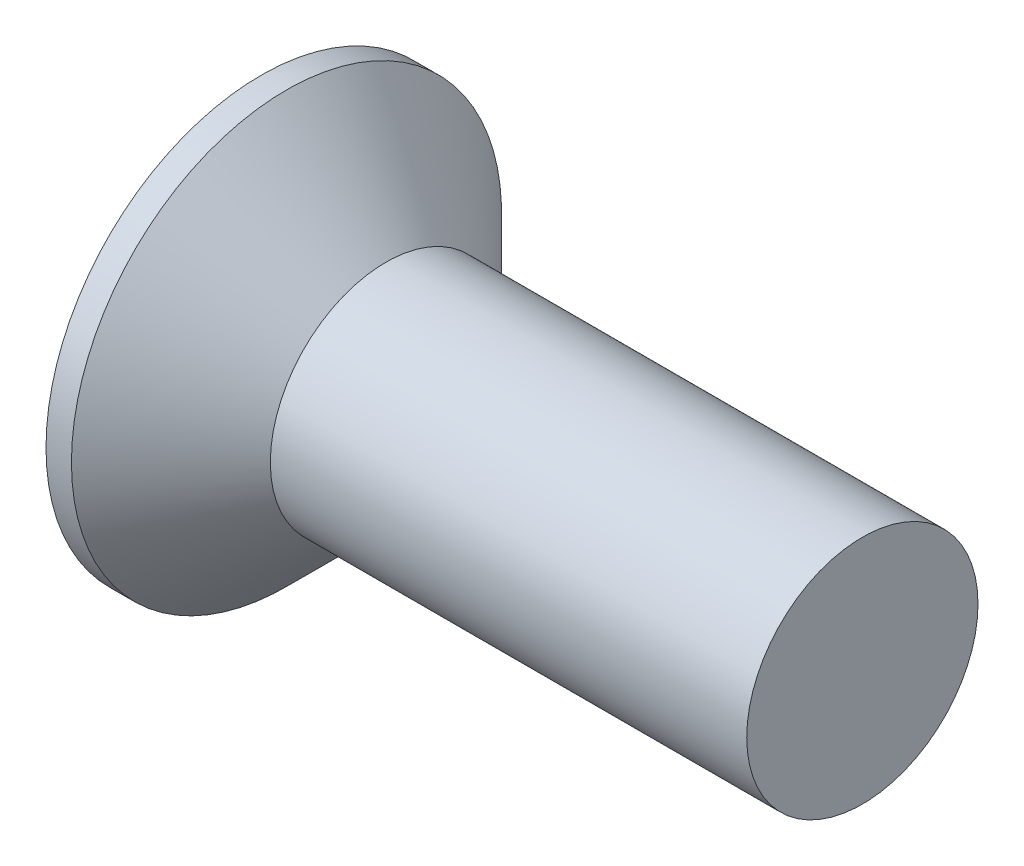
ISO-10303-21;
HEADER;
FILE_DESCRIPTION(('STEP AP214'),'2;1');
FILE_NAME('part.step','',(''),(''),'','','');
FILE_SCHEMA(('AUTOMOTIVE_DESIGN { 1 0 10303 214 1 1 1 1 }'));
ENDSEC;
DATA;
#1=APPLICATION_CONTEXT('core data for automotive mechanical design processes');
#2=APPLICATION_PROTOCOL_DEFINITION('international standard','automotive_design',2000,#1);
#3=PRODUCT_CONTEXT('',#1,'mechanical');
#4=PRODUCT('Part','Part','',(#3));
#5=PRODUCT_RELATED_PRODUCT_CATEGORY('part','',(#4));
#6=PRODUCT_DEFINITION_FORMATION('','',#4);
#7=PRODUCT_DEFINITION_CONTEXT('part definition',#1,'design');
#8=PRODUCT_DEFINITION('design','',#6,#7);
#9=PRODUCT_DEFINITION_SHAPE('','',#8);
#10=(LENGTH_UNIT() NAMED_UNIT(*) SI_UNIT(.MILLI.,.METRE.));
#11=(NAMED_UNIT(*) PLANE_ANGLE_UNIT() SI_UNIT($,.RADIAN.));
#12=(NAMED_UNIT(*) SI_UNIT($,.STERADIAN.) SOLID_ANGLE_UNIT());
#13=UNCERTAINTY_MEASURE_WITH_UNIT(LENGTH_MEASURE(1.E-05),#10,'distance_accuracy_value','');
#14=(GEOMETRIC_REPRESENTATION_CONTEXT(3) GLOBAL_UNCERTAINTY_ASSIGNED_CONTEXT((#13)) GLOBAL_UNIT_ASSIGNED_CONTEXT((#10,
#11,#12)) REPRESENTATION_CONTEXT('',''));
#15=CARTESIAN_POINT('',(0.,0.,0.));
#16=DIRECTION('',(0.,0.,1.));
#17=DIRECTION('',(1.,0.,0.));
#18=AXIS2_PLACEMENT_3D('',#15,#16,#17);
#19=CARTESIAN_POINT('',(3.35,0.26,-0.26));
#20=DIRECTION('',(1.,0.,0.));
#21=DIRECTION('',(0.,0.,-1.));
#22=AXIS2_PLACEMENT_3D('',#19,#20,#21);
#23=PLANE('',#22);
#24=DIRECTION('',(0.,0.,1.));
#25=VECTOR('',#24,1.);
#26=CARTESIAN_POINT('',(3.35,-0.260000000000001,-0.52));
#27=LINE('',#26,#25);
#28=CARTESIAN_POINT('',(3.35,-0.260000000000001,0.259999999999999));
#29=VERTEX_POINT('',#28);
#30=CARTESIAN_POINT('',(3.35,-0.260000000000001,-0.260000000000001));
#31=VERTEX_POINT('',#30);
#32=EDGE_CURVE('E83',#29,#31,#27,.F.);
#33=ORIENTED_EDGE('',*,*,#32,.F.);
#34=DIRECTION('',(0.,1.,0.));
#35=VECTOR('',#34,1.);
#36=CARTESIAN_POINT('',(3.35,-0.520000000000009,0.259999999999998));
#37=LINE('',#36,#35);
#38=CARTESIAN_POINT('',(3.35,0.26,0.26));
#39=VERTEX_POINT('',#38);
#40=EDGE_CURVE('E122',#39,#29,#37,.F.);
#41=ORIENTED_EDGE('',*,*,#40,.F.);
#42=DIRECTION('',(0.,0.,1.));
#43=VECTOR('',#42,1.);
#44=CARTESIAN_POINT('',(3.35,0.259999999999999,0.52));
#45=LINE('',#44,#43);
#46=CARTESIAN_POINT('',(3.35,0.26,-0.260000000000001));
#47=VERTEX_POINT('',#46);
#48=EDGE_CURVE('E79',#47,#39,#45,.T.);
#49=ORIENTED_EDGE('',*,*,#48,.F.);
#50=DIRECTION('',(0.,1.,0.));
#51=VECTOR('',#50,1.);
#52=CARTESIAN_POINT('',(3.35,0.520000000000009,-0.26));
#53=LINE('',#52,#51);
#54=EDGE_CURVE('E81',#31,#47,#53,.T.);
#55=ORIENTED_EDGE('',*,*,#54,.F.);
#56=EDGE_LOOP('',(#33,#41,#49,#55));
#57=FACE_BOUND('',#56,.T.);
#58=ADVANCED_FACE('F17',(#57),#23,.F.);
#59=CARTESIAN_POINT('',(0.,0.520000000000009,-2.53));
#60=DIRECTION('',(-0.560957422052894,0.,0.827844653690396));
#61=DIRECTION('',(0.827844653690396,0.,0.560957422052894));
#62=AXIS2_PLACEMENT_3D('',#59,#60,#61);
#63=PLANE('',#62);
#64=DIRECTION('',(-0.826141195234385,-0.0641184211226667,-0.559803138263299));
#65=VECTOR('',#64,1.);
#66=CARTESIAN_POINT('',(3.35,-0.259999999999999,-0.260000000000001));
#67=LINE('',#66,#65);
#68=CARTESIAN_POINT('',(0.,-0.519999999999993,-2.53));
#69=VERTEX_POINT('',#68);
#70=EDGE_CURVE('E100',#31,#69,#67,.T.);
#71=ORIENTED_EDGE('',*,*,#70,.F.);
#72=ORIENTED_EDGE('',*,*,#54,.T.);
#73=DIRECTION('',(0.826141195234385,-0.0641184211226705,0.559803138263299));
#74=VECTOR('',#73,1.);
#75=CARTESIAN_POINT('',(0.,0.520000000000009,-2.53));
#76=LINE('',#75,#74);
#77=CARTESIAN_POINT('',(0.,0.520000000000009,-2.53));
#78=VERTEX_POINT('',#77);
#79=EDGE_CURVE('E115',#78,#47,#76,.T.);
#80=ORIENTED_EDGE('',*,*,#79,.F.);
#81=DIRECTION('',(0.,1.,0.));
#82=VECTOR('',#81,1.);
#83=CARTESIAN_POINT('',(0.,0.520000000000009,-2.53));
#84=LINE('',#83,#82);
#85=EDGE_CURVE('E90',#78,#69,#84,.F.);
#86=ORIENTED_EDGE('',*,*,#85,.T.);
#87=EDGE_LOOP('',(#71,#72,#80,#86));
#88=FACE_BOUND('',#87,.T.);
#89=ADVANCED_FACE('F101',(#88),#63,.T.);
#90=CARTESIAN_POINT('',(0.,2.53,0.52));
#91=DIRECTION('',(-0.560957422052895,-0.827844653690395,0.));
#92=DIRECTION('',(0.827844653690395,-0.560957422052895,0.));
#93=AXIS2_PLACEMENT_3D('',#90,#91,#92);
#94=PLANE('',#93);
#95=DIRECTION('',(-0.826141195234385,0.5598031382633,-0.0641184211226686));
#96=VECTOR('',#95,1.);
#97=CARTESIAN_POINT('',(3.35,0.26,-0.26));
#98=LINE('',#97,#96);
#99=CARTESIAN_POINT('',(0.,2.53,-0.52));
#100=VERTEX_POINT('',#99);
#101=EDGE_CURVE('E156',#47,#100,#98,.T.);
#102=ORIENTED_EDGE('',*,*,#101,.F.);
#103=ORIENTED_EDGE('',*,*,#48,.T.);
#104=DIRECTION('',(0.826141195234385,-0.559803138263299,-0.0641184211226685));
#105=VECTOR('',#104,1.);
#106=CARTESIAN_POINT('',(0.,2.53,0.52));
#107=LINE('',#106,#105);
#108=CARTESIAN_POINT('',(0.,2.53,0.52));
#109=VERTEX_POINT('',#108);
#110=EDGE_CURVE('E153',#109,#39,#107,.T.);
#111=ORIENTED_EDGE('',*,*,#110,.F.);
#112=DIRECTION('',(0.,0.,1.));
#113=VECTOR('',#112,1.);
#114=CARTESIAN_POINT('',(0.,2.53,0.52));
#115=LINE('',#114,#113);
#116=EDGE_CURVE('E89',#109,#100,#115,.F.);
#117=ORIENTED_EDGE('',*,*,#116,.T.);
#118=EDGE_LOOP('',(#102,#103,#111,#117));
#119=FACE_BOUND('',#118,.T.);
#120=ADVANCED_FACE('F171',(#119),#94,.T.);
#121=CARTESIAN_POINT('',(0.,-0.520000000000009,2.53));
#122=DIRECTION('',(-0.560957422052895,0.,-0.827844653690395));
#123=DIRECTION('',(-0.827844653690395,0.,0.560957422052895));
#124=AXIS2_PLACEMENT_3D('',#121,#122,#123);
#125=PLANE('',#124);
#126=DIRECTION('',(-0.826141195234385,0.0641184211226666,0.5598031382633));
#127=VECTOR('',#126,1.);
#128=CARTESIAN_POINT('',(3.35,0.259999999999999,0.26));
#129=LINE('',#128,#127);
#130=CARTESIAN_POINT('',(0.,0.519999999999992,2.53));
#131=VERTEX_POINT('',#130);
#132=EDGE_CURVE('E150',#39,#131,#129,.T.);
#133=ORIENTED_EDGE('',*,*,#132,.F.);
#134=ORIENTED_EDGE('',*,*,#40,.T.);
#135=DIRECTION('',(0.826141195234385,0.0641184211226705,-0.559803138263299));
#136=VECTOR('',#135,1.);
#137=CARTESIAN_POINT('',(0.,-0.520000000000009,2.53));
#138=LINE('',#137,#136);
#139=CARTESIAN_POINT('',(0.,-0.520000000000009,2.53));
#140=VERTEX_POINT('',#139);
#141=EDGE_CURVE('E144',#140,#29,#138,.T.);
#142=ORIENTED_EDGE('',*,*,#141,.F.);
#143=DIRECTION('',(0.,1.,0.));
#144=VECTOR('',#143,1.);
#145=CARTESIAN_POINT('',(0.,-0.520000000000009,2.53));
#146=LINE('',#145,#144);
#147=EDGE_CURVE('E124',#140,#131,#146,.T.);
#148=ORIENTED_EDGE('',*,*,#147,.T.);
#149=EDGE_LOOP('',(#133,#134,#142,#148));
#150=FACE_BOUND('',#149,.T.);
#151=ADVANCED_FACE('F199',(#150),#125,.T.);
#152=CARTESIAN_POINT('',(0.,-2.53,-0.52));
#153=DIRECTION('',(-0.560957422052894,0.827844653690396,0.));
#154=DIRECTION('',(-0.827844653690396,-0.560957422052894,0.));
#155=AXIS2_PLACEMENT_3D('',#152,#153,#154);
#156=PLANE('',#155);
#157=DIRECTION('',(-0.826141195234385,-0.559803138263299,0.0641184211226687));
#158=VECTOR('',#157,1.);
#159=CARTESIAN_POINT('',(3.35,-0.260000000000001,0.26));
#160=LINE('',#159,#158);
#161=CARTESIAN_POINT('',(0.,-2.53,0.52));
#162=VERTEX_POINT('',#161);
#163=EDGE_CURVE('E96',#29,#162,#160,.T.);
#164=ORIENTED_EDGE('',*,*,#163,.F.);
#165=ORIENTED_EDGE('',*,*,#32,.T.);
#166=DIRECTION('',(0.826141195234385,0.559803138263299,0.0641184211226686));
#167=VECTOR('',#166,1.);
#168=CARTESIAN_POINT('',(0.,-2.53,-0.52));
#169=LINE('',#168,#167);
#170=CARTESIAN_POINT('',(0.,-2.53,-0.52));
#171=VERTEX_POINT('',#170);
#172=EDGE_CURVE('E94',#171,#31,#169,.T.);
#173=ORIENTED_EDGE('',*,*,#172,.F.);
#174=DIRECTION('',(0.,0.,1.));
#175=VECTOR('',#174,1.);
#176=CARTESIAN_POINT('',(0.,-2.53,-0.52));
#177=LINE('',#176,#175);
#178=EDGE_CURVE('E35',#171,#162,#177,.T.);
#179=ORIENTED_EDGE('',*,*,#178,.T.);
#180=EDGE_LOOP('',(#164,#165,#173,#179));
#181=FACE_BOUND('',#180,.T.);
#182=ADVANCED_FACE('F92',(#181),#156,.T.);
#183=CARTESIAN_POINT('',(3.73370044052863,0.,-0.230220264317181));
#184=DIRECTION('',(-0.077379238892827,0.,0.997001731888349));
#185=DIRECTION('',(0.997001731888349,0.,0.077379238892827));
#186=AXIS2_PLACEMENT_3D('',#183,#184,#185);
#187=PLANE('',#186);
#188=DIRECTION('',(0.994030271895774,0.0771486181172837,0.0771486181172836));
#189=VECTOR('',#188,1.);
#190=CARTESIAN_POINT('',(0.,-0.519999999999998,-0.52));
#191=LINE('',#190,#189);
#192=CARTESIAN_POINT('',(0.,-0.519999999999998,-0.52));
#193=VERTEX_POINT('',#192);
#194=EDGE_CURVE('E106',#193,#31,#191,.T.);
#195=ORIENTED_EDGE('',*,*,#194,.F.);
#196=DIRECTION('',(0.,1.,0.));
#197=VECTOR('',#196,1.);
#198=CARTESIAN_POINT('',(0.,0.,-0.52));
#199=LINE('',#198,#197);
#200=EDGE_CURVE('E111',#171,#193,#199,.T.);
#201=ORIENTED_EDGE('',*,*,#200,.F.);
#202=ORIENTED_EDGE('',*,*,#172,.T.);
#203=EDGE_LOOP('',(#195,#201,#202));
#204=FACE_BOUND('',#203,.T.);
#205=ADVANCED_FACE('F109',(#204),#187,.T.);
#206=CARTESIAN_POINT('',(3.73370044052864,-0.230220264317181,0.));
#207=DIRECTION('',(-0.077379238892827,0.997001731888349,0.));
#208=DIRECTION('',(-0.997001731888349,-0.077379238892827,0.));
#209=AXIS2_PLACEMENT_3D('',#206,#207,#208);
#210=PLANE('',#209);
#211=DIRECTION('',(0.,0.,1.));
#212=VECTOR('',#211,1.);
#213=CARTESIAN_POINT('',(0.,-0.519999999999998,0.));
#214=LINE('',#213,#212);
#215=EDGE_CURVE('E114',#193,#69,#214,.F.);
#216=ORIENTED_EDGE('',*,*,#215,.F.);
#217=ORIENTED_EDGE('',*,*,#194,.T.);
#218=ORIENTED_EDGE('',*,*,#70,.T.);
#219=EDGE_LOOP('',(#216,#217,#218));
#220=FACE_BOUND('',#219,.T.);
#221=ADVANCED_FACE('F113',(#220),#210,.T.);
#222=CARTESIAN_POINT('',(3.73370044052863,0.230220264317181,0.));
#223=DIRECTION('',(-0.077379238892827,-0.997001731888349,0.));
#224=DIRECTION('',(0.997001731888349,-0.077379238892827,0.));
#225=AXIS2_PLACEMENT_3D('',#222,#223,#224);
#226=PLANE('',#225);
#227=ORIENTED_EDGE('',*,*,#79,.T.);
#228=DIRECTION('',(0.994030271895774,-0.0771486181172845,0.0771486181172839));
#229=VECTOR('',#228,1.);
#230=CARTESIAN_POINT('',(0.,0.520000000000001,-0.52));
#231=LINE('',#230,#229);
#232=CARTESIAN_POINT('',(0.,0.520000000000003,-0.52));
#233=VERTEX_POINT('',#232);
#234=EDGE_CURVE('E117',#233,#47,#231,.T.);
#235=ORIENTED_EDGE('',*,*,#234,.F.);
#236=DIRECTION('',(0.,0.,1.));
#237=VECTOR('',#236,1.);
#238=CARTESIAN_POINT('',(0.,0.520000000000009,0.));
#239=LINE('',#238,#237);
#240=EDGE_CURVE('E169',#78,#233,#239,.T.);
#241=ORIENTED_EDGE('',*,*,#240,.F.);
#242=EDGE_LOOP('',(#227,#235,#241));
#243=FACE_BOUND('',#242,.T.);
#244=ADVANCED_FACE('F168',(#243),#226,.T.);
#245=CARTESIAN_POINT('',(3.73370044052863,0.,-0.230220264317181));
#246=DIRECTION('',(-0.077379238892827,0.,0.997001731888349));
#247=DIRECTION('',(0.997001731888349,0.,0.077379238892827));
#248=AXIS2_PLACEMENT_3D('',#245,#246,#247);
#249=PLANE('',#248);
#250=ORIENTED_EDGE('',*,*,#234,.T.);
#251=ORIENTED_EDGE('',*,*,#101,.T.);
#252=DIRECTION('',(0.,1.,0.));
#253=VECTOR('',#252,1.);
#254=CARTESIAN_POINT('',(0.,0.,-0.52));
#255=LINE('',#254,#253);
#256=EDGE_CURVE('E164',#233,#100,#255,.T.);
#257=ORIENTED_EDGE('',*,*,#256,.F.);
#258=EDGE_LOOP('',(#250,#251,#257));
#259=FACE_BOUND('',#258,.T.);
#260=ADVANCED_FACE('F161',(#259),#249,.T.);
#261=CARTESIAN_POINT('',(3.73370044052864,0.,0.230220264317181));
#262=DIRECTION('',(-0.077379238892827,0.,-0.997001731888349));
#263=DIRECTION('',(-0.997001731888349,0.,0.077379238892827));
#264=AXIS2_PLACEMENT_3D('',#261,#262,#263);
#265=PLANE('',#264);
#266=DIRECTION('',(0.994030271895774,-0.0771486181172836,-0.0771486181172839));
#267=VECTOR('',#266,1.);
#268=CARTESIAN_POINT('',(0.,0.519999999999998,0.52));
#269=LINE('',#268,#267);
#270=CARTESIAN_POINT('',(0.,0.519999999999998,0.52));
#271=VERTEX_POINT('',#270);
#272=EDGE_CURVE('E147',#271,#39,#269,.T.);
#273=ORIENTED_EDGE('',*,*,#272,.F.);
#274=DIRECTION('',(0.,1.,0.));
#275=VECTOR('',#274,1.);
#276=CARTESIAN_POINT('',(0.,0.,0.52));
#277=LINE('',#276,#275);
#278=EDGE_CURVE('E181',#109,#271,#277,.F.);
#279=ORIENTED_EDGE('',*,*,#278,.F.);
#280=ORIENTED_EDGE('',*,*,#110,.T.);
#281=EDGE_LOOP('',(#273,#279,#280));
#282=FACE_BOUND('',#281,.T.);
#283=ADVANCED_FACE('F201',(#282),#265,.T.);
#284=CARTESIAN_POINT('',(3.73370044052863,0.230220264317181,0.));
#285=DIRECTION('',(-0.077379238892827,-0.997001731888349,0.));
#286=DIRECTION('',(0.997001731888349,-0.077379238892827,0.));
#287=AXIS2_PLACEMENT_3D('',#284,#285,#286);
#288=PLANE('',#287);
#289=DIRECTION('',(0.,0.,1.));
#290=VECTOR('',#289,1.);
#291=CARTESIAN_POINT('',(0.,0.519999999999998,0.));
#292=LINE('',#291,#290);
#293=EDGE_CURVE('E183',#271,#131,#292,.T.);
#294=ORIENTED_EDGE('',*,*,#293,.F.);
#295=ORIENTED_EDGE('',*,*,#272,.T.);
#296=ORIENTED_EDGE('',*,*,#132,.T.);
#297=EDGE_LOOP('',(#294,#295,#296));
#298=FACE_BOUND('',#297,.T.);
#299=ADVANCED_FACE('F197',(#298),#288,.T.);
#300=CARTESIAN_POINT('',(3.73370044052864,-0.230220264317181,0.));
#301=DIRECTION('',(-0.077379238892827,0.997001731888349,0.));
#302=DIRECTION('',(-0.997001731888349,-0.077379238892827,0.));
#303=AXIS2_PLACEMENT_3D('',#300,#301,#302);
#304=PLANE('',#303);
#305=ORIENTED_EDGE('',*,*,#141,.T.);
#306=DIRECTION('',(0.994030271895774,0.0771486181172842,-0.0771486181172839));
#307=VECTOR('',#306,1.);
#308=CARTESIAN_POINT('',(0.,-0.520000000000002,0.52));
#309=LINE('',#308,#307);
#310=CARTESIAN_POINT('',(0.,-0.520000000000003,0.52));
#311=VERTEX_POINT('',#310);
#312=EDGE_CURVE('E142',#311,#29,#309,.T.);
#313=ORIENTED_EDGE('',*,*,#312,.F.);
#314=DIRECTION('',(0.,0.,1.));
#315=VECTOR('',#314,1.);
#316=CARTESIAN_POINT('',(0.,-0.520000000000009,0.));
#317=LINE('',#316,#315);
#318=EDGE_CURVE('E190',#140,#311,#317,.F.);
#319=ORIENTED_EDGE('',*,*,#318,.F.);
#320=EDGE_LOOP('',(#305,#313,#319));
#321=FACE_BOUND('',#320,.T.);
#322=ADVANCED_FACE('F209',(#321),#304,.T.);
#323=CARTESIAN_POINT('',(3.73370044052864,0.,0.230220264317181));
#324=DIRECTION('',(-0.077379238892827,0.,-0.997001731888349));
#325=DIRECTION('',(-0.997001731888349,0.,0.077379238892827));
#326=AXIS2_PLACEMENT_3D('',#323,#324,#325);
#327=PLANE('',#326);
#328=ORIENTED_EDGE('',*,*,#312,.T.);
#329=ORIENTED_EDGE('',*,*,#163,.T.);
#330=DIRECTION('',(0.,1.,0.));
#331=VECTOR('',#330,1.);
#332=CARTESIAN_POINT('',(0.,0.,0.52));
#333=LINE('',#332,#331);
#334=EDGE_CURVE('E137',#311,#162,#333,.F.);
#335=ORIENTED_EDGE('',*,*,#334,.F.);
#336=EDGE_LOOP('',(#328,#329,#335));
#337=FACE_BOUND('',#336,.T.);
#338=ADVANCED_FACE('F232',(#337),#327,.T.);
#339=CARTESIAN_POINT('',(0.,0.,0.));
#340=DIRECTION('',(-1.,0.,0.));
#341=DIRECTION('',(0.,0.,1.));
#342=AXIS2_PLACEMENT_3D('',#339,#340,#341);
#343=PLANE('',#342);
#344=ORIENTED_EDGE('',*,*,#334,.T.);
#345=ORIENTED_EDGE('',*,*,#178,.F.);
#346=ORIENTED_EDGE('',*,*,#200,.T.);
#347=ORIENTED_EDGE('',*,*,#215,.T.);
#348=ORIENTED_EDGE('',*,*,#85,.F.);
#349=ORIENTED_EDGE('',*,*,#240,.T.);
#350=ORIENTED_EDGE('',*,*,#256,.T.);
#351=ORIENTED_EDGE('',*,*,#116,.F.);
#352=ORIENTED_EDGE('',*,*,#278,.T.);
#353=ORIENTED_EDGE('',*,*,#293,.T.);
#354=ORIENTED_EDGE('',*,*,#147,.F.);
#355=ORIENTED_EDGE('',*,*,#318,.T.);
#356=EDGE_LOOP('',(#344,#345,#346,#347,#348,#349,#350,#351,#352,#353,#354,#355));
#357=FACE_BOUND('',#356,.T.);
#358=CARTESIAN_POINT('',(0.,0.,0.));
#359=DIRECTION('',(-1.,0.,0.));
#360=DIRECTION('',(0.,0.,1.));
#361=AXIS2_PLACEMENT_3D('',#358,#359,#360);
#362=CIRCLE('',#361,4.65);
#363=CARTESIAN_POINT('',(0.,0.,4.65));
#364=VERTEX_POINT('',#363);
#365=EDGE_CURVE('E20',#364,#364,#362,.F.);
#366=ORIENTED_EDGE('',*,*,#365,.F.);
#367=EDGE_LOOP('',(#366));
#368=FACE_BOUND('',#367,.T.);
#369=ADVANCED_FACE('F178',(#357,#368),#343,.T.);
#370=CARTESIAN_POINT('',(-6.34999999999999,0.,0.));
#371=DIRECTION('',(-1.,0.,0.));
#372=DIRECTION('',(0.,0.,1.));
#373=AXIS2_PLACEMENT_3D('',#370,#371,#372);
#374=CYLINDRICAL_SURFACE('',#373,4.65);
#375=ORIENTED_EDGE('',*,*,#365,.T.);
#376=EDGE_LOOP('',(#375));
#377=FACE_BOUND('',#376,.T.);
#378=CARTESIAN_POINT('',(0.550000000032469,0.,0.));
#379=DIRECTION('',(-1.,0.,0.));
#380=DIRECTION('',(0.,0.,1.));
#381=AXIS2_PLACEMENT_3D('',#378,#379,#380);
#382=CIRCLE('',#381,4.65000000002647);
#383=CARTESIAN_POINT('',(0.550000000032469,0.,4.65000000002647));
#384=VERTEX_POINT('',#383);
#385=EDGE_CURVE('E129',#384,#384,#382,.F.);
#386=ORIENTED_EDGE('',*,*,#385,.F.);
#387=EDGE_LOOP('',(#386));
#388=FACE_BOUND('',#387,.T.);
#389=ADVANCED_FACE('F225',(#377,#388),#374,.T.);
#390=CARTESIAN_POINT('',(13.,2.5,0.));
#391=DIRECTION('',(1.,0.,0.));
#392=DIRECTION('',(0.,0.,-1.));
#393=AXIS2_PLACEMENT_3D('',#390,#391,#392);
#394=PLANE('',#393);
#395=CARTESIAN_POINT('',(13.,0.,0.));
#396=DIRECTION('',(-1.,0.,0.));
#397=DIRECTION('',(0.,0.,1.));
#398=AXIS2_PLACEMENT_3D('',#395,#396,#397);
#399=CIRCLE('',#398,2.5);
#400=CARTESIAN_POINT('',(13.,0.,2.5));
#401=VERTEX_POINT('',#400);
#402=EDGE_CURVE('E26',#401,#401,#399,.T.);
#403=ORIENTED_EDGE('',*,*,#402,.F.);
#404=EDGE_LOOP('',(#403));
#405=FACE_BOUND('',#404,.T.);
#406=ADVANCED_FACE('F220',(#405),#394,.T.);
#407=CARTESIAN_POINT('',(0.550000000089312,0.,0.));
#408=DIRECTION('',(-1.,0.,0.));
#409=DIRECTION('',(0.,0.,1.));
#410=AXIS2_PLACEMENT_3D('',#407,#408,#409);
#411=CONICAL_SURFACE('',#410,4.64999999996962,0.785398163397448);
#412=ORIENTED_EDGE('',*,*,#385,.T.);
#413=EDGE_LOOP('',(#412));
#414=FACE_BOUND('',#413,.T.);
#415=CARTESIAN_POINT('',(2.7,0.,0.));
#416=DIRECTION('',(-1.,0.,0.));
#417=DIRECTION('',(0.,0.,1.));
#418=AXIS2_PLACEMENT_3D('',#415,#416,#417);
#419=CIRCLE('',#418,2.5);
#420=CARTESIAN_POINT('',(2.7,0.,2.5));
#421=VERTEX_POINT('',#420);
#422=EDGE_CURVE('E11',#421,#421,#419,.F.);
#423=ORIENTED_EDGE('',*,*,#422,.F.);
#424=EDGE_LOOP('',(#423));
#425=FACE_BOUND('',#424,.T.);
#426=ADVANCED_FACE('F214',(#414,#425),#411,.T.);
#427=CARTESIAN_POINT('',(-6.34999999999999,0.,0.));
#428=DIRECTION('',(-1.,0.,0.));
#429=DIRECTION('',(0.,0.,1.));
#430=AXIS2_PLACEMENT_3D('',#427,#428,#429);
#431=CYLINDRICAL_SURFACE('',#430,2.5);
#432=ORIENTED_EDGE('',*,*,#422,.T.);
#433=EDGE_LOOP('',(#432));
#434=FACE_BOUND('',#433,.T.);
#435=ORIENTED_EDGE('',*,*,#402,.T.);
#436=EDGE_LOOP('',(#435));
#437=FACE_BOUND('',#436,.T.);
#438=ADVANCED_FACE('F212',(#434,#437),#431,.T.);
#439=CLOSED_SHELL('',(#58,#89,#120,#151,#182,#205,#221,#244,#260,#283,#299,#322,#338,#369,#389,
#406,#426,#438));
#440=MANIFOLD_SOLID_BREP('B1',#439);
#441=ADVANCED_BREP_SHAPE_REPRESENTATION('',(#18,#440),#14);
#442=SHAPE_DEFINITION_REPRESENTATION(#9,#441);
ENDSEC;
END-ISO-10303-21;
